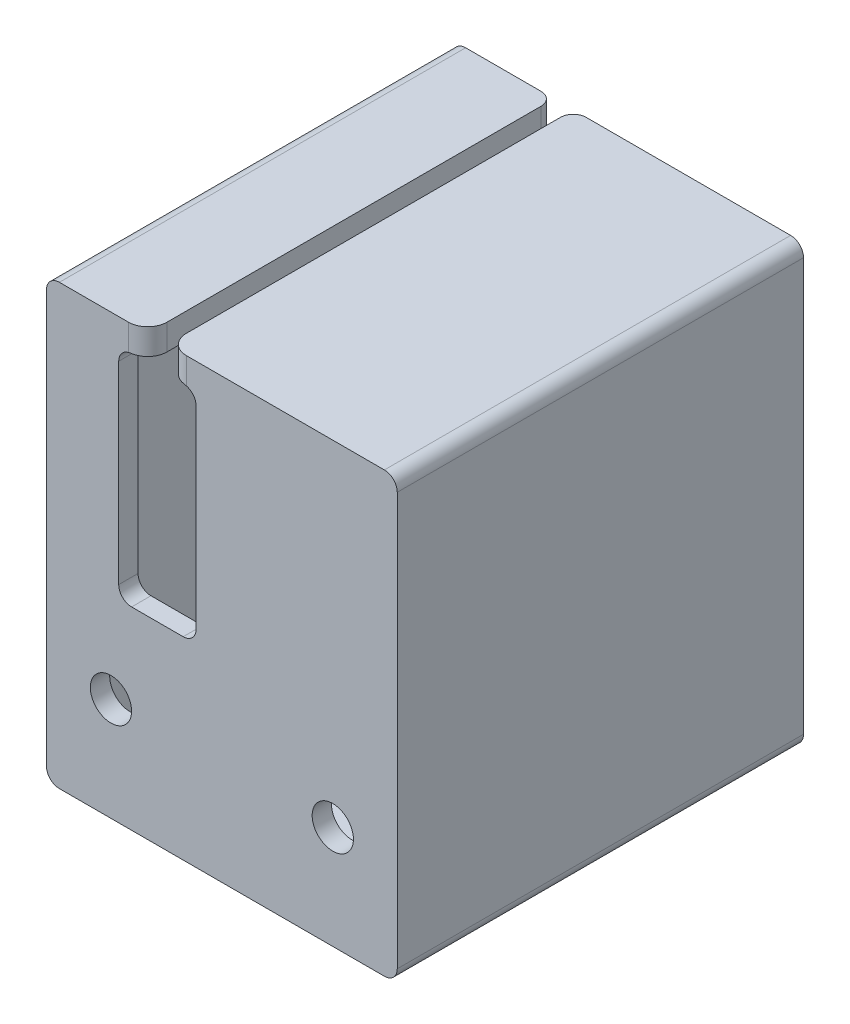
ISO-10303-21;
HEADER;
FILE_DESCRIPTION(('STEP AP214'),'2;1');
FILE_NAME('part.step','',(''),(''),'','','');
FILE_SCHEMA(('AUTOMOTIVE_DESIGN { 1 0 10303 214 1 1 1 1 }'));
ENDSEC;
DATA;
#1=APPLICATION_CONTEXT('core data for automotive mechanical design processes');
#2=APPLICATION_PROTOCOL_DEFINITION('international standard','automotive_design',2000,#1);
#3=PRODUCT_CONTEXT('',#1,'mechanical');
#4=PRODUCT('Part','Part','',(#3));
#5=PRODUCT_RELATED_PRODUCT_CATEGORY('part','',(#4));
#6=PRODUCT_DEFINITION_FORMATION('','',#4);
#7=PRODUCT_DEFINITION_CONTEXT('part definition',#1,'design');
#8=PRODUCT_DEFINITION('design','',#6,#7);
#9=PRODUCT_DEFINITION_SHAPE('','',#8);
#10=(LENGTH_UNIT() NAMED_UNIT(*) SI_UNIT(.MILLI.,.METRE.));
#11=(NAMED_UNIT(*) PLANE_ANGLE_UNIT() SI_UNIT($,.RADIAN.));
#12=(NAMED_UNIT(*) SI_UNIT($,.STERADIAN.) SOLID_ANGLE_UNIT());
#13=UNCERTAINTY_MEASURE_WITH_UNIT(LENGTH_MEASURE(1.E-05),#10,'distance_accuracy_value','');
#14=(GEOMETRIC_REPRESENTATION_CONTEXT(3) GLOBAL_UNCERTAINTY_ASSIGNED_CONTEXT((#13)) GLOBAL_UNIT_ASSIGNED_CONTEXT((#10,
#11,#12)) REPRESENTATION_CONTEXT('',''));
#15=CARTESIAN_POINT('',(0.,0.,0.));
#16=DIRECTION('',(0.,0.,1.));
#17=DIRECTION('',(1.,0.,0.));
#18=AXIS2_PLACEMENT_3D('',#15,#16,#17);
#19=CARTESIAN_POINT('',(13.6,17.,30.));
#20=DIRECTION('',(0.,-1.,0.));
#21=DIRECTION('',(0.,0.,-1.));
#22=AXIS2_PLACEMENT_3D('',#19,#20,#21);
#23=PLANE('',#22);
#24=DIRECTION('',(0.,0.,1.));
#25=VECTOR('',#24,1.);
#26=CARTESIAN_POINT('',(-4.25,17.,-2.5));
#27=LINE('',#26,#25);
#28=CARTESIAN_POINT('',(-4.25,17.,1.));
#29=VERTEX_POINT('',#28);
#30=CARTESIAN_POINT('',(-4.25,17.,30.));
#31=VERTEX_POINT('',#30);
#32=EDGE_CURVE('E430',#29,#31,#27,.T.);
#33=ORIENTED_EDGE('',*,*,#32,.T.);
#34=CARTESIAN_POINT('',(-2.75,17.,30.));
#35=DIRECTION('',(0.,-1.,0.));
#36=DIRECTION('',(0.,0.,-1.));
#37=AXIS2_PLACEMENT_3D('',#34,#35,#36);
#38=CIRCLE('',#37,1.5);
#39=CARTESIAN_POINT('',(-2.75,17.,31.5));
#40=VERTEX_POINT('',#39);
#41=EDGE_CURVE('E404',#31,#40,#38,.F.);
#42=ORIENTED_EDGE('',*,*,#41,.T.);
#43=DIRECTION('',(-1.,0.,0.));
#44=VECTOR('',#43,1.);
#45=CARTESIAN_POINT('',(13.6,17.,31.5));
#46=LINE('',#45,#44);
#47=CARTESIAN_POINT('',(12.6,17.,31.5));
#48=VERTEX_POINT('',#47);
#49=EDGE_CURVE('E421',#48,#40,#46,.T.);
#50=ORIENTED_EDGE('',*,*,#49,.F.);
#51=DIRECTION('',(0.,0.,-1.));
#52=VECTOR('',#51,1.);
#53=CARTESIAN_POINT('',(12.6,17.,30.));
#54=LINE('',#53,#52);
#55=CARTESIAN_POINT('',(12.6,17.,0.));
#56=VERTEX_POINT('',#55);
#57=EDGE_CURVE('E278',#48,#56,#54,.T.);
#58=ORIENTED_EDGE('',*,*,#57,.T.);
#59=DIRECTION('',(-1.,0.,0.));
#60=VECTOR('',#59,1.);
#61=CARTESIAN_POINT('',(13.6,17.,0.));
#62=LINE('',#61,#60);
#63=CARTESIAN_POINT('',(-3.25,17.,0.));
#64=VERTEX_POINT('',#63);
#65=EDGE_CURVE('E272',#56,#64,#62,.T.);
#66=ORIENTED_EDGE('',*,*,#65,.T.);
#67=CARTESIAN_POINT('',(-3.25,17.,1.));
#68=DIRECTION('',(0.,-1.,0.));
#69=DIRECTION('',(0.,0.,-1.));
#70=AXIS2_PLACEMENT_3D('',#67,#68,#69);
#71=CIRCLE('',#70,1.);
#72=EDGE_CURVE('E356',#64,#29,#71,.F.);
#73=ORIENTED_EDGE('',*,*,#72,.T.);
#74=EDGE_LOOP('',(#33,#42,#50,#58,#66,#73));
#75=FACE_BOUND('',#74,.T.);
#76=ADVANCED_FACE('F43',(#75),#23,.F.);
#77=CARTESIAN_POINT('',(11.6,15.,30.));
#78=DIRECTION('',(0.,-1.,0.));
#79=DIRECTION('',(1.,0.,0.));
#80=AXIS2_PLACEMENT_3D('',#77,#78,#79);
#81=PLANE('',#80);
#82=DIRECTION('',(0.,0.,1.));
#83=VECTOR('',#82,1.);
#84=CARTESIAN_POINT('',(-3.,15.,31.5));
#85=LINE('',#84,#83);
#86=CARTESIAN_POINT('',(-3.,15.,30.));
#87=VERTEX_POINT('',#86);
#88=CARTESIAN_POINT('',(-3.,15.,31.4790199457749));
#89=VERTEX_POINT('',#88);
#90=EDGE_CURVE('E328',#87,#89,#85,.T.);
#91=ORIENTED_EDGE('',*,*,#90,.T.);
#92=CARTESIAN_POINT('',(-2.75,15.,30.));
#93=DIRECTION('',(0.,-1.,0.));
#94=DIRECTION('',(1.,0.,0.));
#95=AXIS2_PLACEMENT_3D('',#92,#93,#94);
#96=CIRCLE('',#95,1.5);
#97=CARTESIAN_POINT('',(-4.25,15.,30.));
#98=VERTEX_POINT('',#97);
#99=EDGE_CURVE('E11',#89,#98,#96,.T.);
#100=ORIENTED_EDGE('',*,*,#99,.T.);
#101=DIRECTION('',(0.,0.,1.));
#102=VECTOR('',#101,1.);
#103=CARTESIAN_POINT('',(-4.25,15.,-2.5));
#104=LINE('',#103,#102);
#105=CARTESIAN_POINT('',(-4.25,15.,1.));
#106=VERTEX_POINT('',#105);
#107=EDGE_CURVE('E432',#106,#98,#104,.T.);
#108=ORIENTED_EDGE('',*,*,#107,.F.);
#109=CARTESIAN_POINT('',(-3.25,15.,1.));
#110=DIRECTION('',(0.,-1.,0.));
#111=DIRECTION('',(1.,0.,0.));
#112=AXIS2_PLACEMENT_3D('',#109,#110,#111);
#113=CIRCLE('',#112,1.);
#114=CARTESIAN_POINT('',(-3.25,15.,0.));
#115=VERTEX_POINT('',#114);
#116=EDGE_CURVE('E360',#106,#115,#113,.T.);
#117=ORIENTED_EDGE('',*,*,#116,.T.);
#118=DIRECTION('',(-1.,0.,0.));
#119=VECTOR('',#118,1.);
#120=CARTESIAN_POINT('',(11.6,15.,0.));
#121=LINE('',#120,#119);
#122=CARTESIAN_POINT('',(11.6,15.,0.));
#123=VERTEX_POINT('',#122);
#124=EDGE_CURVE('E251',#123,#115,#121,.T.);
#125=ORIENTED_EDGE('',*,*,#124,.F.);
#126=DIRECTION('',(0.,0.,-1.));
#127=VECTOR('',#126,1.);
#128=CARTESIAN_POINT('',(11.6,15.,30.));
#129=LINE('',#128,#127);
#130=CARTESIAN_POINT('',(11.6,15.,30.));
#131=VERTEX_POINT('',#130);
#132=EDGE_CURVE('E262',#131,#123,#129,.T.);
#133=ORIENTED_EDGE('',*,*,#132,.F.);
#134=DIRECTION('',(-1.,0.,0.));
#135=VECTOR('',#134,1.);
#136=CARTESIAN_POINT('',(11.6,15.,30.));
#137=LINE('',#136,#135);
#138=EDGE_CURVE('E486',#131,#87,#137,.T.);
#139=ORIENTED_EDGE('',*,*,#138,.T.);
#140=EDGE_LOOP('',(#91,#100,#108,#117,#125,#133,#139));
#141=FACE_BOUND('',#140,.T.);
#142=ADVANCED_FACE('F501',(#141),#81,.T.);
#143=CARTESIAN_POINT('',(0.,0.,0.));
#144=DIRECTION('',(0.,0.,-1.));
#145=DIRECTION('',(-1.,0.,0.));
#146=AXIS2_PLACEMENT_3D('',#143,#144,#145);
#147=PLANE('',#146);
#148=ORIENTED_EDGE('',*,*,#124,.T.);
#149=DIRECTION('',(0.,1.,0.));
#150=VECTOR('',#149,1.);
#151=CARTESIAN_POINT('',(-3.25,17.,0.));
#152=LINE('',#151,#150);
#153=EDGE_CURVE('E353',#115,#64,#152,.T.);
#154=ORIENTED_EDGE('',*,*,#153,.T.);
#155=ORIENTED_EDGE('',*,*,#65,.F.);
#156=CARTESIAN_POINT('',(12.6,16.,0.));
#157=DIRECTION('',(0.,0.,-1.));
#158=DIRECTION('',(-1.,0.,0.));
#159=AXIS2_PLACEMENT_3D('',#156,#157,#158);
#160=CIRCLE('',#159,1.);
#161=CARTESIAN_POINT('',(13.6,16.,0.));
#162=VERTEX_POINT('',#161);
#163=EDGE_CURVE('E288',#56,#162,#160,.T.);
#164=ORIENTED_EDGE('',*,*,#163,.T.);
#165=DIRECTION('',(0.,1.,0.));
#166=VECTOR('',#165,1.);
#167=CARTESIAN_POINT('',(13.6,17.,0.));
#168=LINE('',#167,#166);
#169=CARTESIAN_POINT('',(13.6,-16.,0.));
#170=VERTEX_POINT('',#169);
#171=EDGE_CURVE('E268',#170,#162,#168,.T.);
#172=ORIENTED_EDGE('',*,*,#171,.F.);
#173=CARTESIAN_POINT('',(12.6,-16.,0.));
#174=DIRECTION('',(0.,0.,-1.));
#175=DIRECTION('',(-1.,0.,0.));
#176=AXIS2_PLACEMENT_3D('',#173,#174,#175);
#177=CIRCLE('',#176,1.);
#178=CARTESIAN_POINT('',(12.6,-17.,0.));
#179=VERTEX_POINT('',#178);
#180=EDGE_CURVE('E283',#170,#179,#177,.T.);
#181=ORIENTED_EDGE('',*,*,#180,.T.);
#182=DIRECTION('',(1.,0.,0.));
#183=VECTOR('',#182,1.);
#184=CARTESIAN_POINT('',(13.6,-17.,0.));
#185=LINE('',#184,#183);
#186=CARTESIAN_POINT('',(-12.6,-17.,0.));
#187=VERTEX_POINT('',#186);
#188=EDGE_CURVE('E260',#187,#179,#185,.T.);
#189=ORIENTED_EDGE('',*,*,#188,.F.);
#190=CARTESIAN_POINT('',(-12.6,-16.,0.));
#191=DIRECTION('',(0.,0.,-1.));
#192=DIRECTION('',(-1.,0.,0.));
#193=AXIS2_PLACEMENT_3D('',#190,#191,#192);
#194=CIRCLE('',#193,1.);
#195=CARTESIAN_POINT('',(-13.6,-16.,0.));
#196=VERTEX_POINT('',#195);
#197=EDGE_CURVE('E281',#187,#196,#194,.T.);
#198=ORIENTED_EDGE('',*,*,#197,.T.);
#199=DIRECTION('',(0.,-1.,0.));
#200=VECTOR('',#199,1.);
#201=CARTESIAN_POINT('',(-13.6,17.,0.));
#202=LINE('',#201,#200);
#203=CARTESIAN_POINT('',(-13.6,16.,0.));
#204=VERTEX_POINT('',#203);
#205=EDGE_CURVE('E256',#204,#196,#202,.T.);
#206=ORIENTED_EDGE('',*,*,#205,.F.);
#207=CARTESIAN_POINT('',(-12.6,16.,0.));
#208=DIRECTION('',(0.,0.,-1.));
#209=DIRECTION('',(-1.,0.,0.));
#210=AXIS2_PLACEMENT_3D('',#207,#208,#209);
#211=CIRCLE('',#210,1.);
#212=CARTESIAN_POINT('',(-12.6,17.,0.));
#213=VERTEX_POINT('',#212);
#214=EDGE_CURVE('E285',#204,#213,#211,.T.);
#215=ORIENTED_EDGE('',*,*,#214,.T.);
#216=CARTESIAN_POINT('',(-6.75,17.,0.));
#217=VERTEX_POINT('',#216);
#218=EDGE_CURVE('E271',#217,#213,#62,.T.);
#219=ORIENTED_EDGE('',*,*,#218,.F.);
#220=DIRECTION('',(0.,-1.,0.));
#221=VECTOR('',#220,1.);
#222=CARTESIAN_POINT('',(-6.75,15.,0.));
#223=LINE('',#222,#221);
#224=CARTESIAN_POINT('',(-6.75,15.,0.));
#225=VERTEX_POINT('',#224);
#226=EDGE_CURVE('E350',#217,#225,#223,.T.);
#227=ORIENTED_EDGE('',*,*,#226,.T.);
#228=CARTESIAN_POINT('',(-11.6,15.,0.));
#229=VERTEX_POINT('',#228);
#230=EDGE_CURVE('E493',#225,#229,#121,.T.);
#231=ORIENTED_EDGE('',*,*,#230,.T.);
#232=DIRECTION('',(0.,-1.,0.));
#233=VECTOR('',#232,1.);
#234=CARTESIAN_POINT('',(-11.6,15.,0.));
#235=LINE('',#234,#233);
#236=CARTESIAN_POINT('',(-11.6,-15.,0.));
#237=VERTEX_POINT('',#236);
#238=EDGE_CURVE('E482',#229,#237,#235,.T.);
#239=ORIENTED_EDGE('',*,*,#238,.T.);
#240=DIRECTION('',(1.,0.,0.));
#241=VECTOR('',#240,1.);
#242=CARTESIAN_POINT('',(11.6,-15.,0.));
#243=LINE('',#242,#241);
#244=CARTESIAN_POINT('',(11.6,-15.,0.));
#245=VERTEX_POINT('',#244);
#246=EDGE_CURVE('E255',#237,#245,#243,.T.);
#247=ORIENTED_EDGE('',*,*,#246,.T.);
#248=DIRECTION('',(0.,1.,0.));
#249=VECTOR('',#248,1.);
#250=CARTESIAN_POINT('',(11.6,15.,0.));
#251=LINE('',#250,#249);
#252=EDGE_CURVE('E490',#245,#123,#251,.T.);
#253=ORIENTED_EDGE('',*,*,#252,.T.);
#254=EDGE_LOOP('',(#148,#154,#155,#164,#172,#181,#189,#198,#206,#215,#219,#227,#231,#239,#247,#253));
#255=FACE_BOUND('',#254,.T.);
#256=ADVANCED_FACE('F505',(#255),#147,.T.);
#257=CARTESIAN_POINT('',(-13.6,17.,30.));
#258=DIRECTION('',(1.,0.,0.));
#259=DIRECTION('',(0.,0.,-1.));
#260=AXIS2_PLACEMENT_3D('',#257,#258,#259);
#261=PLANE('',#260);
#262=DIRECTION('',(0.,-1.,0.));
#263=VECTOR('',#262,1.);
#264=CARTESIAN_POINT('',(-13.6,17.,31.5));
#265=LINE('',#264,#263);
#266=CARTESIAN_POINT('',(-13.6,16.,31.5));
#267=VERTEX_POINT('',#266);
#268=CARTESIAN_POINT('',(-13.6,-16.,31.5));
#269=VERTEX_POINT('',#268);
#270=EDGE_CURVE('E472',#267,#269,#265,.T.);
#271=ORIENTED_EDGE('',*,*,#270,.F.);
#272=DIRECTION('',(0.,0.,-1.));
#273=VECTOR('',#272,1.);
#274=CARTESIAN_POINT('',(-13.6,16.,30.));
#275=LINE('',#274,#273);
#276=EDGE_CURVE('E305',#267,#204,#275,.T.);
#277=ORIENTED_EDGE('',*,*,#276,.T.);
#278=ORIENTED_EDGE('',*,*,#205,.T.);
#279=DIRECTION('',(0.,0.,-1.));
#280=VECTOR('',#279,1.);
#281=CARTESIAN_POINT('',(-13.6,-16.,30.));
#282=LINE('',#281,#280);
#283=EDGE_CURVE('E303',#196,#269,#282,.F.);
#284=ORIENTED_EDGE('',*,*,#283,.T.);
#285=EDGE_LOOP('',(#271,#277,#278,#284));
#286=FACE_BOUND('',#285,.T.);
#287=ADVANCED_FACE('F585',(#286),#261,.F.);
#288=CARTESIAN_POINT('',(13.6,-17.,30.));
#289=DIRECTION('',(0.,1.,0.));
#290=DIRECTION('',(0.,0.,1.));
#291=AXIS2_PLACEMENT_3D('',#288,#289,#290);
#292=PLANE('',#291);
#293=ORIENTED_EDGE('',*,*,#188,.T.);
#294=DIRECTION('',(0.,0.,-1.));
#295=VECTOR('',#294,1.);
#296=CARTESIAN_POINT('',(12.6,-17.,30.));
#297=LINE('',#296,#295);
#298=CARTESIAN_POINT('',(12.6,-17.,31.5));
#299=VERTEX_POINT('',#298);
#300=EDGE_CURVE('E311',#179,#299,#297,.F.);
#301=ORIENTED_EDGE('',*,*,#300,.T.);
#302=DIRECTION('',(1.,0.,0.));
#303=VECTOR('',#302,1.);
#304=CARTESIAN_POINT('',(13.6,-17.,31.5));
#305=LINE('',#304,#303);
#306=CARTESIAN_POINT('',(-12.6,-17.,31.5));
#307=VERTEX_POINT('',#306);
#308=EDGE_CURVE('E475',#307,#299,#305,.T.);
#309=ORIENTED_EDGE('',*,*,#308,.F.);
#310=DIRECTION('',(0.,0.,-1.));
#311=VECTOR('',#310,1.);
#312=CARTESIAN_POINT('',(-12.6,-17.,30.));
#313=LINE('',#312,#311);
#314=EDGE_CURVE('E308',#307,#187,#313,.T.);
#315=ORIENTED_EDGE('',*,*,#314,.T.);
#316=EDGE_LOOP('',(#293,#301,#309,#315));
#317=FACE_BOUND('',#316,.T.);
#318=ADVANCED_FACE('F563',(#317),#292,.F.);
#319=CARTESIAN_POINT('',(13.6,17.,30.));
#320=DIRECTION('',(-1.,0.,0.));
#321=DIRECTION('',(0.,0.,1.));
#322=AXIS2_PLACEMENT_3D('',#319,#320,#321);
#323=PLANE('',#322);
#324=ORIENTED_EDGE('',*,*,#171,.T.);
#325=DIRECTION('',(0.,0.,-1.));
#326=VECTOR('',#325,1.);
#327=CARTESIAN_POINT('',(13.6,16.,30.));
#328=LINE('',#327,#326);
#329=CARTESIAN_POINT('',(13.6,16.,31.5));
#330=VERTEX_POINT('',#329);
#331=EDGE_CURVE('E293',#162,#330,#328,.F.);
#332=ORIENTED_EDGE('',*,*,#331,.T.);
#333=DIRECTION('',(0.,1.,0.));
#334=VECTOR('',#333,1.);
#335=CARTESIAN_POINT('',(13.6,17.,31.5));
#336=LINE('',#335,#334);
#337=CARTESIAN_POINT('',(13.6,-16.,31.5));
#338=VERTEX_POINT('',#337);
#339=EDGE_CURVE('E478',#338,#330,#336,.T.);
#340=ORIENTED_EDGE('',*,*,#339,.F.);
#341=DIRECTION('',(0.,0.,-1.));
#342=VECTOR('',#341,1.);
#343=CARTESIAN_POINT('',(13.6,-16.,30.));
#344=LINE('',#343,#342);
#345=EDGE_CURVE('E290',#338,#170,#344,.T.);
#346=ORIENTED_EDGE('',*,*,#345,.T.);
#347=EDGE_LOOP('',(#324,#332,#340,#346));
#348=FACE_BOUND('',#347,.T.);
#349=ADVANCED_FACE('F555',(#348),#323,.F.);
#350=CARTESIAN_POINT('',(-7.25,17.,31.5));
#351=VERTEX_POINT('',#350);
#352=CARTESIAN_POINT('',(-12.6,17.,31.5));
#353=VERTEX_POINT('',#352);
#354=EDGE_CURVE('E481',#351,#353,#46,.T.);
#355=ORIENTED_EDGE('',*,*,#354,.F.);
#356=CARTESIAN_POINT('',(-7.25,17.,30.));
#357=DIRECTION('',(0.,-1.,0.));
#358=DIRECTION('',(0.,0.,-1.));
#359=AXIS2_PLACEMENT_3D('',#356,#357,#358);
#360=CIRCLE('',#359,1.5);
#361=CARTESIAN_POINT('',(-5.75,17.,30.));
#362=VERTEX_POINT('',#361);
#363=EDGE_CURVE('E409',#351,#362,#360,.F.);
#364=ORIENTED_EDGE('',*,*,#363,.T.);
#365=DIRECTION('',(0.,0.,1.));
#366=VECTOR('',#365,1.);
#367=CARTESIAN_POINT('',(-5.75,17.,-2.5));
#368=LINE('',#367,#366);
#369=CARTESIAN_POINT('',(-5.75,17.,1.));
#370=VERTEX_POINT('',#369);
#371=EDGE_CURVE('E434',#370,#362,#368,.T.);
#372=ORIENTED_EDGE('',*,*,#371,.F.);
#373=CARTESIAN_POINT('',(-6.75,17.,1.));
#374=DIRECTION('',(0.,-1.,0.));
#375=DIRECTION('',(0.,0.,-1.));
#376=AXIS2_PLACEMENT_3D('',#373,#374,#375);
#377=CIRCLE('',#376,1.);
#378=EDGE_CURVE('E366',#370,#217,#377,.F.);
#379=ORIENTED_EDGE('',*,*,#378,.T.);
#380=ORIENTED_EDGE('',*,*,#218,.T.);
#381=DIRECTION('',(0.,0.,-1.));
#382=VECTOR('',#381,1.);
#383=CARTESIAN_POINT('',(-12.6,17.,30.));
#384=LINE('',#383,#382);
#385=EDGE_CURVE('E275',#213,#353,#384,.F.);
#386=ORIENTED_EDGE('',*,*,#385,.T.);
#387=EDGE_LOOP('',(#355,#364,#372,#379,#380,#386));
#388=FACE_BOUND('',#387,.T.);
#389=ADVANCED_FACE('F546',(#388),#23,.F.);
#390=CARTESIAN_POINT('',(-11.6,15.,30.));
#391=DIRECTION('',(1.,0.,0.));
#392=DIRECTION('',(0.,1.,0.));
#393=AXIS2_PLACEMENT_3D('',#390,#391,#392);
#394=PLANE('',#393);
#395=ORIENTED_EDGE('',*,*,#238,.F.);
#396=DIRECTION('',(0.,0.,-1.));
#397=VECTOR('',#396,1.);
#398=CARTESIAN_POINT('',(-11.6,15.,30.));
#399=LINE('',#398,#397);
#400=CARTESIAN_POINT('',(-11.6,15.,30.));
#401=VERTEX_POINT('',#400);
#402=EDGE_CURVE('E250',#401,#229,#399,.T.);
#403=ORIENTED_EDGE('',*,*,#402,.F.);
#404=DIRECTION('',(0.,-1.,0.));
#405=VECTOR('',#404,1.);
#406=CARTESIAN_POINT('',(-11.6,15.,30.));
#407=LINE('',#406,#405);
#408=CARTESIAN_POINT('',(-11.6,-15.,30.));
#409=VERTEX_POINT('',#408);
#410=EDGE_CURVE('E235',#401,#409,#407,.T.);
#411=ORIENTED_EDGE('',*,*,#410,.T.);
#412=DIRECTION('',(0.,0.,-1.));
#413=VECTOR('',#412,1.);
#414=CARTESIAN_POINT('',(-11.6,-15.,30.));
#415=LINE('',#414,#413);
#416=EDGE_CURVE('E247',#409,#237,#415,.T.);
#417=ORIENTED_EDGE('',*,*,#416,.T.);
#418=EDGE_LOOP('',(#395,#403,#411,#417));
#419=FACE_BOUND('',#418,.T.);
#420=ADVANCED_FACE('F246',(#419),#394,.T.);
#421=CARTESIAN_POINT('',(11.6,-15.,30.));
#422=DIRECTION('',(0.,1.,0.));
#423=DIRECTION('',(-1.,0.,0.));
#424=AXIS2_PLACEMENT_3D('',#421,#422,#423);
#425=PLANE('',#424);
#426=ORIENTED_EDGE('',*,*,#246,.F.);
#427=ORIENTED_EDGE('',*,*,#416,.F.);
#428=DIRECTION('',(1.,0.,0.));
#429=VECTOR('',#428,1.);
#430=CARTESIAN_POINT('',(11.6,-15.,30.));
#431=LINE('',#430,#429);
#432=CARTESIAN_POINT('',(11.6,-15.,30.));
#433=VERTEX_POINT('',#432);
#434=EDGE_CURVE('E229',#409,#433,#431,.T.);
#435=ORIENTED_EDGE('',*,*,#434,.T.);
#436=DIRECTION('',(0.,0.,-1.));
#437=VECTOR('',#436,1.);
#438=CARTESIAN_POINT('',(11.6,-15.,30.));
#439=LINE('',#438,#437);
#440=EDGE_CURVE('E257',#433,#245,#439,.T.);
#441=ORIENTED_EDGE('',*,*,#440,.T.);
#442=EDGE_LOOP('',(#426,#427,#435,#441));
#443=FACE_BOUND('',#442,.T.);
#444=ADVANCED_FACE('F253',(#443),#425,.T.);
#445=CARTESIAN_POINT('',(11.6,15.,30.));
#446=DIRECTION('',(-1.,0.,0.));
#447=DIRECTION('',(0.,-1.,0.));
#448=AXIS2_PLACEMENT_3D('',#445,#446,#447);
#449=PLANE('',#448);
#450=ORIENTED_EDGE('',*,*,#252,.F.);
#451=ORIENTED_EDGE('',*,*,#440,.F.);
#452=DIRECTION('',(0.,1.,0.));
#453=VECTOR('',#452,1.);
#454=CARTESIAN_POINT('',(11.6,15.,30.));
#455=LINE('',#454,#453);
#456=EDGE_CURVE('E238',#433,#131,#455,.T.);
#457=ORIENTED_EDGE('',*,*,#456,.T.);
#458=ORIENTED_EDGE('',*,*,#132,.T.);
#459=EDGE_LOOP('',(#450,#451,#457,#458));
#460=FACE_BOUND('',#459,.T.);
#461=ADVANCED_FACE('F500',(#460),#449,.T.);
#462=DIRECTION('',(0.,0.,1.));
#463=VECTOR('',#462,1.);
#464=CARTESIAN_POINT('',(-5.75,15.,-2.5));
#465=LINE('',#464,#463);
#466=CARTESIAN_POINT('',(-5.75,15.,1.));
#467=VERTEX_POINT('',#466);
#468=CARTESIAN_POINT('',(-5.75,15.,30.));
#469=VERTEX_POINT('',#468);
#470=EDGE_CURVE('E437',#467,#469,#465,.T.);
#471=ORIENTED_EDGE('',*,*,#470,.T.);
#472=CARTESIAN_POINT('',(-7.25,15.,30.));
#473=DIRECTION('',(0.,-1.,0.));
#474=DIRECTION('',(1.,0.,0.));
#475=AXIS2_PLACEMENT_3D('',#472,#473,#474);
#476=CIRCLE('',#475,1.5);
#477=CARTESIAN_POINT('',(-7.,15.,31.4790199457749));
#478=VERTEX_POINT('',#477);
#479=EDGE_CURVE('E371',#469,#478,#476,.T.);
#480=ORIENTED_EDGE('',*,*,#479,.T.);
#481=DIRECTION('',(0.,0.,1.));
#482=VECTOR('',#481,1.);
#483=CARTESIAN_POINT('',(-7.,15.,30.));
#484=LINE('',#483,#482);
#485=CARTESIAN_POINT('',(-7.,15.,30.));
#486=VERTEX_POINT('',#485);
#487=EDGE_CURVE('E330',#478,#486,#484,.F.);
#488=ORIENTED_EDGE('',*,*,#487,.T.);
#489=EDGE_CURVE('E485',#486,#401,#137,.T.);
#490=ORIENTED_EDGE('',*,*,#489,.T.);
#491=ORIENTED_EDGE('',*,*,#402,.T.);
#492=ORIENTED_EDGE('',*,*,#230,.F.);
#493=CARTESIAN_POINT('',(-6.75,15.,1.));
#494=DIRECTION('',(0.,-1.,0.));
#495=DIRECTION('',(1.,0.,0.));
#496=AXIS2_PLACEMENT_3D('',#493,#494,#495);
#497=CIRCLE('',#496,1.);
#498=EDGE_CURVE('E362',#225,#467,#497,.T.);
#499=ORIENTED_EDGE('',*,*,#498,.T.);
#500=EDGE_LOOP('',(#471,#480,#488,#490,#491,#492,#499));
#501=FACE_BOUND('',#500,.T.);
#502=ADVANCED_FACE('F508',(#501),#81,.T.);
#503=CARTESIAN_POINT('',(0.,0.,30.));
#504=DIRECTION('',(0.,0.,-1.));
#505=DIRECTION('',(-1.,0.,0.));
#506=AXIS2_PLACEMENT_3D('',#503,#504,#505);
#507=PLANE('',#506);
#508=DIRECTION('',(0.,1.,0.));
#509=VECTOR('',#508,1.);
#510=CARTESIAN_POINT('',(-8.,0.,30.));
#511=LINE('',#510,#509);
#512=CARTESIAN_POINT('',(-8.,-0.999999999999996,30.));
#513=VERTEX_POINT('',#512);
#514=CARTESIAN_POINT('',(-8.,14.,30.));
#515=VERTEX_POINT('',#514);
#516=EDGE_CURVE('E469',#513,#515,#511,.T.);
#517=ORIENTED_EDGE('',*,*,#516,.F.);
#518=CARTESIAN_POINT('',(-7.,-0.999999999999996,30.));
#519=DIRECTION('',(0.,0.,-1.));
#520=DIRECTION('',(-1.,0.,0.));
#521=AXIS2_PLACEMENT_3D('',#518,#519,#520);
#522=CIRCLE('',#521,1.);
#523=CARTESIAN_POINT('',(-7.,-2.,30.));
#524=VERTEX_POINT('',#523);
#525=EDGE_CURVE('E338',#513,#524,#522,.F.);
#526=ORIENTED_EDGE('',*,*,#525,.T.);
#527=DIRECTION('',(-1.,0.,0.));
#528=VECTOR('',#527,1.);
#529=CARTESIAN_POINT('',(0.,-2.,30.));
#530=LINE('',#529,#528);
#531=CARTESIAN_POINT('',(-3.,-2.,30.));
#532=VERTEX_POINT('',#531);
#533=EDGE_CURVE('E466',#532,#524,#530,.T.);
#534=ORIENTED_EDGE('',*,*,#533,.F.);
#535=CARTESIAN_POINT('',(-3.,-0.999999999999997,30.));
#536=DIRECTION('',(0.,0.,-1.));
#537=DIRECTION('',(-1.,0.,0.));
#538=AXIS2_PLACEMENT_3D('',#535,#536,#537);
#539=CIRCLE('',#538,1.);
#540=CARTESIAN_POINT('',(-2.,-0.999999999999997,30.));
#541=VERTEX_POINT('',#540);
#542=EDGE_CURVE('E334',#532,#541,#539,.F.);
#543=ORIENTED_EDGE('',*,*,#542,.T.);
#544=DIRECTION('',(0.,1.,0.));
#545=VECTOR('',#544,1.);
#546=CARTESIAN_POINT('',(-2.,0.,30.));
#547=LINE('',#546,#545);
#548=CARTESIAN_POINT('',(-2.,14.,30.));
#549=VERTEX_POINT('',#548);
#550=EDGE_CURVE('E463',#541,#549,#547,.T.);
#551=ORIENTED_EDGE('',*,*,#550,.T.);
#552=CARTESIAN_POINT('',(-3.,14.,30.));
#553=DIRECTION('',(0.,0.,-1.));
#554=DIRECTION('',(-1.,0.,0.));
#555=AXIS2_PLACEMENT_3D('',#552,#553,#554);
#556=CIRCLE('',#555,1.);
#557=EDGE_CURVE('E347',#549,#87,#556,.F.);
#558=ORIENTED_EDGE('',*,*,#557,.T.);
#559=ORIENTED_EDGE('',*,*,#138,.F.);
#560=ORIENTED_EDGE('',*,*,#456,.F.);
#561=ORIENTED_EDGE('',*,*,#434,.F.);
#562=ORIENTED_EDGE('',*,*,#410,.F.);
#563=ORIENTED_EDGE('',*,*,#489,.F.);
#564=CARTESIAN_POINT('',(-7.,14.,30.));
#565=DIRECTION('',(0.,0.,-1.));
#566=DIRECTION('',(-1.,0.,0.));
#567=AXIS2_PLACEMENT_3D('',#564,#565,#566);
#568=CIRCLE('',#567,1.);
#569=EDGE_CURVE('E343',#486,#515,#568,.F.);
#570=ORIENTED_EDGE('',*,*,#569,.T.);
#571=EDGE_LOOP('',(#517,#526,#534,#543,#551,#558,#559,#560,#561,#562,#563,#570));
#572=FACE_BOUND('',#571,.T.);
#573=CARTESIAN_POINT('',(-8.60000000000001,-9.00000000000001,30.));
#574=DIRECTION('',(0.,0.,-1.));
#575=DIRECTION('',(-1.,0.,0.));
#576=AXIS2_PLACEMENT_3D('',#573,#574,#575);
#577=CIRCLE('',#576,1.6);
#578=CARTESIAN_POINT('',(-10.2,-9.00000000000001,30.));
#579=VERTEX_POINT('',#578);
#580=EDGE_CURVE('E460',#579,#579,#577,.T.);
#581=ORIENTED_EDGE('',*,*,#580,.F.);
#582=EDGE_LOOP('',(#581));
#583=FACE_BOUND('',#582,.T.);
#584=CARTESIAN_POINT('',(8.60000000000001,-9.00000000000001,30.));
#585=DIRECTION('',(0.,0.,-1.));
#586=DIRECTION('',(-1.,0.,0.));
#587=AXIS2_PLACEMENT_3D('',#584,#585,#586);
#588=CIRCLE('',#587,1.6);
#589=CARTESIAN_POINT('',(7.00000000000001,-9.00000000000001,30.));
#590=VERTEX_POINT('',#589);
#591=EDGE_CURVE('E446',#590,#590,#588,.T.);
#592=ORIENTED_EDGE('',*,*,#591,.F.);
#593=EDGE_LOOP('',(#592));
#594=FACE_BOUND('',#593,.T.);
#595=ADVANCED_FACE('F232',(#572,#583,#594),#507,.T.);
#596=CARTESIAN_POINT('',(0.,0.,31.5));
#597=DIRECTION('',(0.,0.,-1.));
#598=DIRECTION('',(-1.,0.,0.));
#599=AXIS2_PLACEMENT_3D('',#596,#597,#598);
#600=PLANE('',#599);
#601=CARTESIAN_POINT('',(-7.,14.,31.5));
#602=DIRECTION('',(0.,0.,-1.));
#603=DIRECTION('',(-1.,0.,0.));
#604=AXIS2_PLACEMENT_3D('',#601,#602,#603);
#605=CIRCLE('',#604,1.);
#606=CARTESIAN_POINT('',(-8.,14.,31.5));
#607=VERTEX_POINT('',#606);
#608=CARTESIAN_POINT('',(-7.25,14.9682458365518,31.5));
#609=VERTEX_POINT('',#608);
#610=EDGE_CURVE('E340',#607,#609,#605,.T.);
#611=ORIENTED_EDGE('',*,*,#610,.T.);
#612=DIRECTION('',(0.,-1.,0.));
#613=VECTOR('',#612,1.);
#614=CARTESIAN_POINT('',(-7.25,0.,31.5));
#615=LINE('',#614,#613);
#616=EDGE_CURVE('E410',#609,#351,#615,.F.);
#617=ORIENTED_EDGE('',*,*,#616,.T.);
#618=ORIENTED_EDGE('',*,*,#354,.T.);
#619=CARTESIAN_POINT('',(-12.6,16.,31.5));
#620=DIRECTION('',(0.,0.,-1.));
#621=DIRECTION('',(-1.,0.,0.));
#622=AXIS2_PLACEMENT_3D('',#619,#620,#621);
#623=CIRCLE('',#622,1.);
#624=EDGE_CURVE('E299',#353,#267,#623,.F.);
#625=ORIENTED_EDGE('',*,*,#624,.T.);
#626=ORIENTED_EDGE('',*,*,#270,.T.);
#627=CARTESIAN_POINT('',(-12.6,-16.,31.5));
#628=DIRECTION('',(0.,0.,-1.));
#629=DIRECTION('',(-1.,0.,0.));
#630=AXIS2_PLACEMENT_3D('',#627,#628,#629);
#631=CIRCLE('',#630,1.);
#632=EDGE_CURVE('E295',#269,#307,#631,.F.);
#633=ORIENTED_EDGE('',*,*,#632,.T.);
#634=ORIENTED_EDGE('',*,*,#308,.T.);
#635=CARTESIAN_POINT('',(12.6,-16.,31.5));
#636=DIRECTION('',(0.,0.,-1.));
#637=DIRECTION('',(-1.,0.,0.));
#638=AXIS2_PLACEMENT_3D('',#635,#636,#637);
#639=CIRCLE('',#638,1.);
#640=EDGE_CURVE('E297',#299,#338,#639,.F.);
#641=ORIENTED_EDGE('',*,*,#640,.T.);
#642=ORIENTED_EDGE('',*,*,#339,.T.);
#643=CARTESIAN_POINT('',(12.6,16.,31.5));
#644=DIRECTION('',(0.,0.,-1.));
#645=DIRECTION('',(-1.,0.,0.));
#646=AXIS2_PLACEMENT_3D('',#643,#644,#645);
#647=CIRCLE('',#646,1.);
#648=EDGE_CURVE('E301',#330,#48,#647,.F.);
#649=ORIENTED_EDGE('',*,*,#648,.T.);
#650=ORIENTED_EDGE('',*,*,#49,.T.);
#651=DIRECTION('',(0.,1.,0.));
#652=VECTOR('',#651,1.);
#653=CARTESIAN_POINT('',(-2.75,0.,31.5));
#654=LINE('',#653,#652);
#655=CARTESIAN_POINT('',(-2.75,14.9682458365518,31.5));
#656=VERTEX_POINT('',#655);
#657=EDGE_CURVE('E380',#40,#656,#654,.F.);
#658=ORIENTED_EDGE('',*,*,#657,.T.);
#659=CARTESIAN_POINT('',(-3.,14.,31.5));
#660=DIRECTION('',(0.,0.,-1.));
#661=DIRECTION('',(-1.,0.,0.));
#662=AXIS2_PLACEMENT_3D('',#659,#660,#661);
#663=CIRCLE('',#662,1.);
#664=CARTESIAN_POINT('',(-2.,14.,31.5));
#665=VERTEX_POINT('',#664);
#666=EDGE_CURVE('E345',#656,#665,#663,.T.);
#667=ORIENTED_EDGE('',*,*,#666,.T.);
#668=DIRECTION('',(0.,-1.,0.));
#669=VECTOR('',#668,1.);
#670=CARTESIAN_POINT('',(-2.,0.,31.5));
#671=LINE('',#670,#669);
#672=CARTESIAN_POINT('',(-2.,-0.999999999999997,31.5));
#673=VERTEX_POINT('',#672);
#674=EDGE_CURVE('E444',#665,#673,#671,.T.);
#675=ORIENTED_EDGE('',*,*,#674,.T.);
#676=CARTESIAN_POINT('',(-3.,-0.999999999999997,31.5));
#677=DIRECTION('',(0.,0.,-1.));
#678=DIRECTION('',(-1.,0.,0.));
#679=AXIS2_PLACEMENT_3D('',#676,#677,#678);
#680=CIRCLE('',#679,1.);
#681=CARTESIAN_POINT('',(-3.,-2.,31.5));
#682=VERTEX_POINT('',#681);
#683=EDGE_CURVE('E332',#673,#682,#680,.T.);
#684=ORIENTED_EDGE('',*,*,#683,.T.);
#685=DIRECTION('',(1.,0.,0.));
#686=VECTOR('',#685,1.);
#687=CARTESIAN_POINT('',(0.,-2.,31.5));
#688=LINE('',#687,#686);
#689=CARTESIAN_POINT('',(-7.,-2.,31.5));
#690=VERTEX_POINT('',#689);
#691=EDGE_CURVE('E447',#690,#682,#688,.T.);
#692=ORIENTED_EDGE('',*,*,#691,.F.);
#693=CARTESIAN_POINT('',(-7.,-0.999999999999996,31.5));
#694=DIRECTION('',(0.,0.,-1.));
#695=DIRECTION('',(-1.,0.,0.));
#696=AXIS2_PLACEMENT_3D('',#693,#694,#695);
#697=CIRCLE('',#696,1.);
#698=CARTESIAN_POINT('',(-8.,-0.999999999999996,31.5));
#699=VERTEX_POINT('',#698);
#700=EDGE_CURVE('E336',#690,#699,#697,.T.);
#701=ORIENTED_EDGE('',*,*,#700,.T.);
#702=DIRECTION('',(0.,-1.,0.));
#703=VECTOR('',#702,1.);
#704=CARTESIAN_POINT('',(-8.,0.,31.5));
#705=LINE('',#704,#703);
#706=EDGE_CURVE('E450',#607,#699,#705,.T.);
#707=ORIENTED_EDGE('',*,*,#706,.F.);
#708=EDGE_LOOP('',(#611,#617,#618,#625,#626,#633,#634,#641,#642,#649,#650,#658,#667,#675,#684,
#692,#701,#707));
#709=FACE_BOUND('',#708,.T.);
#710=CARTESIAN_POINT('',(-8.60000000000001,-9.00000000000001,31.5));
#711=DIRECTION('',(0.,0.,1.));
#712=DIRECTION('',(1.,0.,0.));
#713=AXIS2_PLACEMENT_3D('',#710,#711,#712);
#714=CIRCLE('',#713,1.6);
#715=CARTESIAN_POINT('',(-7.00000000000001,-9.00000000000001,31.5));
#716=VERTEX_POINT('',#715);
#717=EDGE_CURVE('E453',#716,#716,#714,.T.);
#718=ORIENTED_EDGE('',*,*,#717,.F.);
#719=EDGE_LOOP('',(#718));
#720=FACE_BOUND('',#719,.T.);
#721=CARTESIAN_POINT('',(8.60000000000001,-9.00000000000001,31.5));
#722=DIRECTION('',(0.,0.,1.));
#723=DIRECTION('',(1.,0.,0.));
#724=AXIS2_PLACEMENT_3D('',#721,#722,#723);
#725=CIRCLE('',#724,1.6);
#726=CARTESIAN_POINT('',(10.2,-9.00000000000001,31.5));
#727=VERTEX_POINT('',#726);
#728=EDGE_CURVE('E443',#727,#727,#725,.T.);
#729=ORIENTED_EDGE('',*,*,#728,.F.);
#730=EDGE_LOOP('',(#729));
#731=FACE_BOUND('',#730,.T.);
#732=ADVANCED_FACE('F416',(#709,#720,#731),#600,.F.);
#733=CARTESIAN_POINT('',(8.60000000000001,-9.00000000000001,-18.0277563773199));
#734=DIRECTION('',(0.,0.,1.));
#735=DIRECTION('',(1.,0.,0.));
#736=AXIS2_PLACEMENT_3D('',#733,#734,#735);
#737=CYLINDRICAL_SURFACE('',#736,1.6);
#738=ORIENTED_EDGE('',*,*,#591,.T.);
#739=EDGE_LOOP('',(#738));
#740=FACE_BOUND('',#739,.T.);
#741=ORIENTED_EDGE('',*,*,#728,.T.);
#742=EDGE_LOOP('',(#741));
#743=FACE_BOUND('',#742,.T.);
#744=ADVANCED_FACE('F636',(#740,#743),#737,.F.);
#745=CARTESIAN_POINT('',(-8.60000000000001,-9.00000000000001,-18.0277563773199));
#746=DIRECTION('',(0.,0.,1.));
#747=DIRECTION('',(1.,0.,0.));
#748=AXIS2_PLACEMENT_3D('',#745,#746,#747);
#749=CYLINDRICAL_SURFACE('',#748,1.6);
#750=ORIENTED_EDGE('',*,*,#580,.T.);
#751=EDGE_LOOP('',(#750));
#752=FACE_BOUND('',#751,.T.);
#753=ORIENTED_EDGE('',*,*,#717,.T.);
#754=EDGE_LOOP('',(#753));
#755=FACE_BOUND('',#754,.T.);
#756=ADVANCED_FACE('F658',(#752,#755),#749,.F.);
#757=CARTESIAN_POINT('',(-8.,0.,-18.0277563773199));
#758=DIRECTION('',(-1.,0.,0.));
#759=DIRECTION('',(0.,-1.,0.));
#760=AXIS2_PLACEMENT_3D('',#757,#758,#759);
#761=PLANE('',#760);
#762=ORIENTED_EDGE('',*,*,#706,.T.);
#763=DIRECTION('',(0.,0.,1.));
#764=VECTOR('',#763,1.);
#765=CARTESIAN_POINT('',(-8.,-0.999999999999996,30.));
#766=LINE('',#765,#764);
#767=EDGE_CURVE('E326',#699,#513,#766,.F.);
#768=ORIENTED_EDGE('',*,*,#767,.T.);
#769=ORIENTED_EDGE('',*,*,#516,.T.);
#770=DIRECTION('',(0.,0.,1.));
#771=VECTOR('',#770,1.);
#772=CARTESIAN_POINT('',(-8.,14.,-18.0277563773199));
#773=LINE('',#772,#771);
#774=EDGE_CURVE('E323',#515,#607,#773,.T.);
#775=ORIENTED_EDGE('',*,*,#774,.T.);
#776=EDGE_LOOP('',(#762,#768,#769,#775));
#777=FACE_BOUND('',#776,.T.);
#778=ADVANCED_FACE('F515',(#777),#761,.F.);
#779=CARTESIAN_POINT('',(0.,-2.,-18.0277563773199));
#780=DIRECTION('',(0.,-1.,0.));
#781=DIRECTION('',(1.,0.,0.));
#782=AXIS2_PLACEMENT_3D('',#779,#780,#781);
#783=PLANE('',#782);
#784=ORIENTED_EDGE('',*,*,#691,.T.);
#785=DIRECTION('',(0.,0.,1.));
#786=VECTOR('',#785,1.);
#787=CARTESIAN_POINT('',(-3.,-2.,-18.0277563773199));
#788=LINE('',#787,#786);
#789=EDGE_CURVE('E321',#682,#532,#788,.F.);
#790=ORIENTED_EDGE('',*,*,#789,.T.);
#791=ORIENTED_EDGE('',*,*,#533,.T.);
#792=DIRECTION('',(0.,0.,1.));
#793=VECTOR('',#792,1.);
#794=CARTESIAN_POINT('',(-7.,-2.,31.5));
#795=LINE('',#794,#793);
#796=EDGE_CURVE('E318',#524,#690,#795,.T.);
#797=ORIENTED_EDGE('',*,*,#796,.T.);
#798=EDGE_LOOP('',(#784,#790,#791,#797));
#799=FACE_BOUND('',#798,.T.);
#800=ADVANCED_FACE('F522',(#799),#783,.F.);
#801=CARTESIAN_POINT('',(-2.,0.,-18.0277563773199));
#802=DIRECTION('',(-1.,0.,0.));
#803=DIRECTION('',(0.,-1.,0.));
#804=AXIS2_PLACEMENT_3D('',#801,#802,#803);
#805=PLANE('',#804);
#806=ORIENTED_EDGE('',*,*,#550,.F.);
#807=DIRECTION('',(0.,0.,1.));
#808=VECTOR('',#807,1.);
#809=CARTESIAN_POINT('',(-2.,-0.999999999999997,-18.0277563773199));
#810=LINE('',#809,#808);
#811=EDGE_CURVE('E315',#541,#673,#810,.T.);
#812=ORIENTED_EDGE('',*,*,#811,.T.);
#813=ORIENTED_EDGE('',*,*,#674,.F.);
#814=DIRECTION('',(0.,0.,1.));
#815=VECTOR('',#814,1.);
#816=CARTESIAN_POINT('',(-2.,14.,30.));
#817=LINE('',#816,#815);
#818=EDGE_CURVE('E313',#665,#549,#817,.F.);
#819=ORIENTED_EDGE('',*,*,#818,.T.);
#820=EDGE_LOOP('',(#806,#812,#813,#819));
#821=FACE_BOUND('',#820,.T.);
#822=ADVANCED_FACE('F531',(#821),#805,.T.);
#823=CARTESIAN_POINT('',(12.6,16.,30.));
#824=DIRECTION('',(0.,0.,-1.));
#825=DIRECTION('',(-1.,0.,0.));
#826=AXIS2_PLACEMENT_3D('',#823,#824,#825);
#827=CYLINDRICAL_SURFACE('',#826,1.);
#828=ORIENTED_EDGE('',*,*,#648,.F.);
#829=ORIENTED_EDGE('',*,*,#331,.F.);
#830=ORIENTED_EDGE('',*,*,#163,.F.);
#831=ORIENTED_EDGE('',*,*,#57,.F.);
#832=EDGE_LOOP('',(#828,#829,#830,#831));
#833=FACE_BOUND('',#832,.T.);
#834=ADVANCED_FACE('F533',(#833),#827,.T.);
#835=CARTESIAN_POINT('',(-12.6,16.,30.));
#836=DIRECTION('',(0.,0.,-1.));
#837=DIRECTION('',(-1.,0.,0.));
#838=AXIS2_PLACEMENT_3D('',#835,#836,#837);
#839=CYLINDRICAL_SURFACE('',#838,1.);
#840=ORIENTED_EDGE('',*,*,#624,.F.);
#841=ORIENTED_EDGE('',*,*,#385,.F.);
#842=ORIENTED_EDGE('',*,*,#214,.F.);
#843=ORIENTED_EDGE('',*,*,#276,.F.);
#844=EDGE_LOOP('',(#840,#841,#842,#843));
#845=FACE_BOUND('',#844,.T.);
#846=ADVANCED_FACE('F539',(#845),#839,.T.);
#847=CARTESIAN_POINT('',(12.6,-16.,30.));
#848=DIRECTION('',(0.,0.,-1.));
#849=DIRECTION('',(-1.,0.,0.));
#850=AXIS2_PLACEMENT_3D('',#847,#848,#849);
#851=CYLINDRICAL_SURFACE('',#850,1.);
#852=ORIENTED_EDGE('',*,*,#640,.F.);
#853=ORIENTED_EDGE('',*,*,#300,.F.);
#854=ORIENTED_EDGE('',*,*,#180,.F.);
#855=ORIENTED_EDGE('',*,*,#345,.F.);
#856=EDGE_LOOP('',(#852,#853,#854,#855));
#857=FACE_BOUND('',#856,.T.);
#858=ADVANCED_FACE('F596',(#857),#851,.T.);
#859=CARTESIAN_POINT('',(-12.6,-16.,30.));
#860=DIRECTION('',(0.,0.,-1.));
#861=DIRECTION('',(-1.,0.,0.));
#862=AXIS2_PLACEMENT_3D('',#859,#860,#861);
#863=CYLINDRICAL_SURFACE('',#862,1.);
#864=ORIENTED_EDGE('',*,*,#632,.F.);
#865=ORIENTED_EDGE('',*,*,#283,.F.);
#866=ORIENTED_EDGE('',*,*,#197,.F.);
#867=ORIENTED_EDGE('',*,*,#314,.F.);
#868=EDGE_LOOP('',(#864,#865,#866,#867));
#869=FACE_BOUND('',#868,.T.);
#870=ADVANCED_FACE('F588',(#869),#863,.T.);
#871=CARTESIAN_POINT('',(-3.,-0.999999999999997,-18.0277563773199));
#872=DIRECTION('',(0.,0.,1.));
#873=DIRECTION('',(1.,0.,0.));
#874=AXIS2_PLACEMENT_3D('',#871,#872,#873);
#875=CYLINDRICAL_SURFACE('',#874,1.);
#876=ORIENTED_EDGE('',*,*,#542,.F.);
#877=ORIENTED_EDGE('',*,*,#789,.F.);
#878=ORIENTED_EDGE('',*,*,#683,.F.);
#879=ORIENTED_EDGE('',*,*,#811,.F.);
#880=EDGE_LOOP('',(#876,#877,#878,#879));
#881=FACE_BOUND('',#880,.T.);
#882=ADVANCED_FACE('F529',(#881),#875,.F.);
#883=CARTESIAN_POINT('',(-7.,-0.999999999999996,-18.0277563773199));
#884=DIRECTION('',(0.,0.,-1.));
#885=DIRECTION('',(-1.,0.,0.));
#886=AXIS2_PLACEMENT_3D('',#883,#884,#885);
#887=CYLINDRICAL_SURFACE('',#886,1.);
#888=ORIENTED_EDGE('',*,*,#525,.F.);
#889=ORIENTED_EDGE('',*,*,#767,.F.);
#890=ORIENTED_EDGE('',*,*,#700,.F.);
#891=ORIENTED_EDGE('',*,*,#796,.F.);
#892=EDGE_LOOP('',(#888,#889,#890,#891));
#893=FACE_BOUND('',#892,.T.);
#894=ADVANCED_FACE('F391',(#893),#887,.F.);
#895=CARTESIAN_POINT('',(-7.,14.,-18.0277563773199));
#896=DIRECTION('',(0.,0.,1.));
#897=DIRECTION('',(1.,0.,0.));
#898=AXIS2_PLACEMENT_3D('',#895,#896,#897);
#899=CYLINDRICAL_SURFACE('',#898,1.);
#900=ORIENTED_EDGE('',*,*,#487,.F.);
#901=CARTESIAN_POINT('',(-7.,15.,31.4790199457749));
#902=CARTESIAN_POINT('',(-7.02091701021196,15.0000025153952,31.4825582805491));
#903=CARTESIAN_POINT('',(-7.04191062831299,14.9993437020047,31.4856477132194));
#904=CARTESIAN_POINT('',(-7.08380690310962,14.9967011699678,31.4909128306246));
#905=CARTESIAN_POINT('',(-7.10470939639546,14.9947250229537,31.4930936222046));
#906=CARTESIAN_POINT('',(-7.1464204676312,14.9894457840571,31.4965658325528));
#907=CARTESIAN_POINT('',(-7.16722904559063,14.986142692309,31.4978572514111));
#908=CARTESIAN_POINT('',(-7.20874947566247,14.9781994826828,31.4995781037945));
#909=CARTESIAN_POINT('',(-7.22946008983579,14.9735518101805,31.5000025544505));
#910=CARTESIAN_POINT('',(-7.25,14.9682458365518,31.5));
#911=B_SPLINE_CURVE_WITH_KNOTS('',3,(#901,#902,#903,#904,#905,#906,#907,#908,#909,#910),
.UNSPECIFIED.,.F.,.F.,(4,2,2,2,4),(0.,0.0636283904974709,0.126894181903398,0.190159966892778,
0.253788358065533),.UNSPECIFIED.);
#912=EDGE_CURVE('E373',#478,#609,#911,.T.);
#913=ORIENTED_EDGE('',*,*,#912,.T.);
#914=ORIENTED_EDGE('',*,*,#610,.F.);
#915=ORIENTED_EDGE('',*,*,#774,.F.);
#916=ORIENTED_EDGE('',*,*,#569,.F.);
#917=EDGE_LOOP('',(#900,#913,#914,#915,#916));
#918=FACE_BOUND('',#917,.T.);
#919=ADVANCED_FACE('F385',(#918),#899,.F.);
#920=CARTESIAN_POINT('',(-3.,14.,30.));
#921=DIRECTION('',(0.,0.,-1.));
#922=DIRECTION('',(-1.,0.,0.));
#923=AXIS2_PLACEMENT_3D('',#920,#921,#922);
#924=CYLINDRICAL_SURFACE('',#923,1.);
#925=ORIENTED_EDGE('',*,*,#666,.F.);
#926=CARTESIAN_POINT('',(-2.75,14.9682458365518,31.5));
#927=CARTESIAN_POINT('',(-2.77053991016421,14.9735518101805,31.5000025544505));
#928=CARTESIAN_POINT('',(-2.79125052433753,14.9781994826828,31.4995781037945));
#929=CARTESIAN_POINT('',(-2.83277095440937,14.986142692309,31.4978572514111));
#930=CARTESIAN_POINT('',(-2.8535795323688,14.9894457840571,31.4965658325528));
#931=CARTESIAN_POINT('',(-2.89529060360454,14.9947250229538,31.4930936222046));
#932=CARTESIAN_POINT('',(-2.91619309689038,14.9967011699678,31.4909128306246));
#933=CARTESIAN_POINT('',(-2.95808937168701,14.9993437020047,31.4856477132194));
#934=CARTESIAN_POINT('',(-2.97908298978803,15.0000025153952,31.4825582805491));
#935=CARTESIAN_POINT('',(-3.,15.,31.4790199457749));
#936=B_SPLINE_CURVE_WITH_KNOTS('',3,(#926,#927,#928,#929,#930,#931,#932,#933,#934,#935),
.UNSPECIFIED.,.F.,.F.,(4,2,2,2,4),(0.,0.0636283911727543,0.126894176162135,0.190159967568059,
0.253788358065532),.UNSPECIFIED.);
#937=EDGE_CURVE('E52',#656,#89,#936,.T.);
#938=ORIENTED_EDGE('',*,*,#937,.T.);
#939=ORIENTED_EDGE('',*,*,#90,.F.);
#940=ORIENTED_EDGE('',*,*,#557,.F.);
#941=ORIENTED_EDGE('',*,*,#818,.F.);
#942=EDGE_LOOP('',(#925,#938,#939,#940,#941));
#943=FACE_BOUND('',#942,.T.);
#944=ADVANCED_FACE('F390',(#943),#924,.F.);
#945=CARTESIAN_POINT('',(-5.75,17.,-2.5));
#946=DIRECTION('',(-1.,0.,0.));
#947=DIRECTION('',(0.,0.,1.));
#948=AXIS2_PLACEMENT_3D('',#945,#946,#947);
#949=PLANE('',#948);
#950=ORIENTED_EDGE('',*,*,#371,.T.);
#951=DIRECTION('',(0.,-1.,0.));
#952=VECTOR('',#951,1.);
#953=CARTESIAN_POINT('',(-5.75,17.,30.));
#954=LINE('',#953,#952);
#955=EDGE_CURVE('E368',#362,#469,#954,.T.);
#956=ORIENTED_EDGE('',*,*,#955,.T.);
#957=ORIENTED_EDGE('',*,*,#470,.F.);
#958=DIRECTION('',(0.,-1.,0.));
#959=VECTOR('',#958,1.);
#960=CARTESIAN_POINT('',(-5.75,17.,1.));
#961=LINE('',#960,#959);
#962=EDGE_CURVE('E364',#467,#370,#961,.F.);
#963=ORIENTED_EDGE('',*,*,#962,.T.);
#964=EDGE_LOOP('',(#950,#956,#957,#963));
#965=FACE_BOUND('',#964,.T.);
#966=ADVANCED_FACE('F397',(#965),#949,.F.);
#967=CARTESIAN_POINT('',(-4.25,17.,-2.5));
#968=DIRECTION('',(1.,0.,0.));
#969=DIRECTION('',(0.,0.,-1.));
#970=AXIS2_PLACEMENT_3D('',#967,#968,#969);
#971=PLANE('',#970);
#972=ORIENTED_EDGE('',*,*,#107,.T.);
#973=DIRECTION('',(0.,1.,0.));
#974=VECTOR('',#973,1.);
#975=CARTESIAN_POINT('',(-4.25,17.,30.));
#976=LINE('',#975,#974);
#977=EDGE_CURVE('E406',#98,#31,#976,.T.);
#978=ORIENTED_EDGE('',*,*,#977,.T.);
#979=ORIENTED_EDGE('',*,*,#32,.F.);
#980=DIRECTION('',(0.,1.,0.));
#981=VECTOR('',#980,1.);
#982=CARTESIAN_POINT('',(-4.25,15.,1.));
#983=LINE('',#982,#981);
#984=EDGE_CURVE('E358',#29,#106,#983,.F.);
#985=ORIENTED_EDGE('',*,*,#984,.T.);
#986=EDGE_LOOP('',(#972,#978,#979,#985));
#987=FACE_BOUND('',#986,.T.);
#988=ADVANCED_FACE('F429',(#987),#971,.F.);
#989=CARTESIAN_POINT('',(-3.25,0.,1.));
#990=DIRECTION('',(0.,-1.,0.));
#991=DIRECTION('',(0.,0.,-1.));
#992=AXIS2_PLACEMENT_3D('',#989,#990,#991);
#993=CYLINDRICAL_SURFACE('',#992,1.);
#994=ORIENTED_EDGE('',*,*,#116,.F.);
#995=ORIENTED_EDGE('',*,*,#984,.F.);
#996=ORIENTED_EDGE('',*,*,#72,.F.);
#997=ORIENTED_EDGE('',*,*,#153,.F.);
#998=EDGE_LOOP('',(#994,#995,#996,#997));
#999=FACE_BOUND('',#998,.T.);
#1000=ADVANCED_FACE('F398',(#999),#993,.T.);
#1001=CARTESIAN_POINT('',(-6.75,0.,1.));
#1002=DIRECTION('',(0.,1.,0.));
#1003=DIRECTION('',(0.,0.,1.));
#1004=AXIS2_PLACEMENT_3D('',#1001,#1002,#1003);
#1005=CYLINDRICAL_SURFACE('',#1004,1.);
#1006=ORIENTED_EDGE('',*,*,#378,.F.);
#1007=ORIENTED_EDGE('',*,*,#962,.F.);
#1008=ORIENTED_EDGE('',*,*,#498,.F.);
#1009=ORIENTED_EDGE('',*,*,#226,.F.);
#1010=EDGE_LOOP('',(#1006,#1007,#1008,#1009));
#1011=FACE_BOUND('',#1010,.T.);
#1012=ADVANCED_FACE('F577',(#1011),#1005,.T.);
#1013=CARTESIAN_POINT('',(-7.25,17.,30.));
#1014=DIRECTION('',(0.,-1.,0.));
#1015=DIRECTION('',(0.,0.,-1.));
#1016=AXIS2_PLACEMENT_3D('',#1013,#1014,#1015);
#1017=CYLINDRICAL_SURFACE('',#1016,1.5);
#1018=ORIENTED_EDGE('',*,*,#363,.F.);
#1019=ORIENTED_EDGE('',*,*,#616,.F.);
#1020=ORIENTED_EDGE('',*,*,#912,.F.);
#1021=ORIENTED_EDGE('',*,*,#479,.F.);
#1022=ORIENTED_EDGE('',*,*,#955,.F.);
#1023=EDGE_LOOP('',(#1018,#1019,#1020,#1021,#1022));
#1024=FACE_BOUND('',#1023,.T.);
#1025=ADVANCED_FACE('F382',(#1024),#1017,.T.);
#1026=CARTESIAN_POINT('',(-2.75,17.,30.));
#1027=DIRECTION('',(0.,1.,0.));
#1028=DIRECTION('',(0.,0.,1.));
#1029=AXIS2_PLACEMENT_3D('',#1026,#1027,#1028);
#1030=CYLINDRICAL_SURFACE('',#1029,1.5);
#1031=ORIENTED_EDGE('',*,*,#937,.F.);
#1032=ORIENTED_EDGE('',*,*,#657,.F.);
#1033=ORIENTED_EDGE('',*,*,#41,.F.);
#1034=ORIENTED_EDGE('',*,*,#977,.F.);
#1035=ORIENTED_EDGE('',*,*,#99,.F.);
#1036=EDGE_LOOP('',(#1031,#1032,#1033,#1034,#1035));
#1037=FACE_BOUND('',#1036,.T.);
#1038=ADVANCED_FACE('F45',(#1037),#1030,.T.);
#1039=CLOSED_SHELL('',(#76,#142,#256,#287,#318,#349,#389,#420,#444,#461,#502,#595,#732,#744,
#756,#778,#800,#822,#834,#846,#858,#870,#882,#894,#919,#944,#966,#988,#1000,#1012,#1025,#1038));
#1040=MANIFOLD_SOLID_BREP('B2',#1039);
#1041=ADVANCED_BREP_SHAPE_REPRESENTATION('',(#18,#1040),#14);
#1042=SHAPE_DEFINITION_REPRESENTATION(#9,#1041);
ENDSEC;
END-ISO-10303-21;
